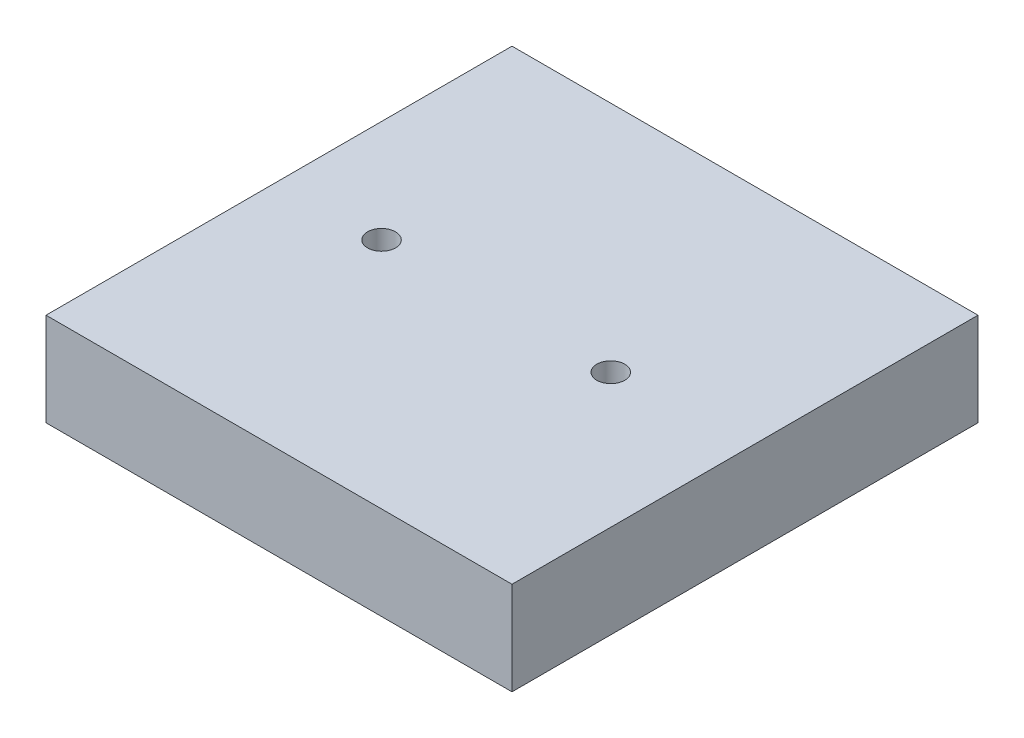
ISO-10303-21;
HEADER;
FILE_DESCRIPTION(('STEP AP214'),'2;1');
FILE_NAME('part.step','',(''),(''),'','','');
FILE_SCHEMA(('AUTOMOTIVE_DESIGN { 1 0 10303 214 1 1 1 1 }'));
ENDSEC;
DATA;
#1=APPLICATION_CONTEXT('core data for automotive mechanical design processes');
#2=APPLICATION_PROTOCOL_DEFINITION('international standard','automotive_design',2000,#1);
#3=PRODUCT_CONTEXT('',#1,'mechanical');
#4=PRODUCT('Part','Part','',(#3));
#5=PRODUCT_RELATED_PRODUCT_CATEGORY('part','',(#4));
#6=PRODUCT_DEFINITION_FORMATION('','',#4);
#7=PRODUCT_DEFINITION_CONTEXT('part definition',#1,'design');
#8=PRODUCT_DEFINITION('design','',#6,#7);
#9=PRODUCT_DEFINITION_SHAPE('','',#8);
#10=(LENGTH_UNIT() NAMED_UNIT(*) SI_UNIT(.MILLI.,.METRE.));
#11=(NAMED_UNIT(*) PLANE_ANGLE_UNIT() SI_UNIT($,.RADIAN.));
#12=(NAMED_UNIT(*) SI_UNIT($,.STERADIAN.) SOLID_ANGLE_UNIT());
#13=UNCERTAINTY_MEASURE_WITH_UNIT(LENGTH_MEASURE(1.E-05),#10,'distance_accuracy_value','');
#14=(GEOMETRIC_REPRESENTATION_CONTEXT(3) GLOBAL_UNCERTAINTY_ASSIGNED_CONTEXT((#13)) GLOBAL_UNIT_ASSIGNED_CONTEXT((#10,
#11,#12)) REPRESENTATION_CONTEXT('',''));
#15=CARTESIAN_POINT('',(0.,0.,0.));
#16=DIRECTION('',(0.,0.,1.));
#17=DIRECTION('',(1.,0.,0.));
#18=AXIS2_PLACEMENT_3D('',#15,#16,#17);
#19=CARTESIAN_POINT('',(0.,10.,25.));
#20=DIRECTION('',(0.,0.,-1.));
#21=DIRECTION('',(-1.,0.,0.));
#22=AXIS2_PLACEMENT_3D('',#19,#20,#21);
#23=PLANE('',#22);
#24=DIRECTION('',(1.,0.,0.));
#25=VECTOR('',#24,1.);
#26=CARTESIAN_POINT('',(0.,0.,25.));
#27=LINE('',#26,#25);
#28=CARTESIAN_POINT('',(-25.,0.,25.));
#29=VERTEX_POINT('',#28);
#30=CARTESIAN_POINT('',(25.,0.,25.));
#31=VERTEX_POINT('',#30);
#32=EDGE_CURVE('E112',#29,#31,#27,.T.);
#33=ORIENTED_EDGE('',*,*,#32,.T.);
#34=DIRECTION('',(0.,-1.,0.));
#35=VECTOR('',#34,1.);
#36=CARTESIAN_POINT('',(25.,10.,25.));
#37=LINE('',#36,#35);
#38=CARTESIAN_POINT('',(25.,10.,25.));
#39=VERTEX_POINT('',#38);
#40=EDGE_CURVE('E11',#39,#31,#37,.T.);
#41=ORIENTED_EDGE('',*,*,#40,.F.);
#42=DIRECTION('',(1.,0.,0.));
#43=VECTOR('',#42,1.);
#44=CARTESIAN_POINT('',(0.,10.,25.));
#45=LINE('',#44,#43);
#46=CARTESIAN_POINT('',(-25.,10.,25.));
#47=VERTEX_POINT('',#46);
#48=EDGE_CURVE('E92',#47,#39,#45,.T.);
#49=ORIENTED_EDGE('',*,*,#48,.F.);
#50=DIRECTION('',(0.,-1.,0.));
#51=VECTOR('',#50,1.);
#52=CARTESIAN_POINT('',(-25.,10.,25.));
#53=LINE('',#52,#51);
#54=EDGE_CURVE('E58',#47,#29,#53,.T.);
#55=ORIENTED_EDGE('',*,*,#54,.T.);
#56=EDGE_LOOP('',(#33,#41,#49,#55));
#57=FACE_BOUND('',#56,.T.);
#58=ADVANCED_FACE('F41',(#57),#23,.F.);
#59=CARTESIAN_POINT('',(25.,10.,0.));
#60=DIRECTION('',(-1.,0.,0.));
#61=DIRECTION('',(0.,0.,1.));
#62=AXIS2_PLACEMENT_3D('',#59,#60,#61);
#63=PLANE('',#62);
#64=DIRECTION('',(0.,0.,-1.));
#65=VECTOR('',#64,1.);
#66=CARTESIAN_POINT('',(25.,0.,0.));
#67=LINE('',#66,#65);
#68=CARTESIAN_POINT('',(25.,0.,-25.));
#69=VERTEX_POINT('',#68);
#70=EDGE_CURVE('E97',#31,#69,#67,.T.);
#71=ORIENTED_EDGE('',*,*,#70,.T.);
#72=DIRECTION('',(0.,-1.,0.));
#73=VECTOR('',#72,1.);
#74=CARTESIAN_POINT('',(25.,10.,-25.));
#75=LINE('',#74,#73);
#76=CARTESIAN_POINT('',(25.,10.,-25.));
#77=VERTEX_POINT('',#76);
#78=EDGE_CURVE('E50',#77,#69,#75,.T.);
#79=ORIENTED_EDGE('',*,*,#78,.F.);
#80=DIRECTION('',(0.,0.,-1.));
#81=VECTOR('',#80,1.);
#82=CARTESIAN_POINT('',(25.,10.,0.));
#83=LINE('',#82,#81);
#84=EDGE_CURVE('E83',#39,#77,#83,.T.);
#85=ORIENTED_EDGE('',*,*,#84,.F.);
#86=ORIENTED_EDGE('',*,*,#40,.T.);
#87=EDGE_LOOP('',(#71,#79,#85,#86));
#88=FACE_BOUND('',#87,.T.);
#89=ADVANCED_FACE('F96',(#88),#63,.F.);
#90=CARTESIAN_POINT('',(0.,10.,-25.));
#91=DIRECTION('',(0.,0.,-1.));
#92=DIRECTION('',(-1.,0.,0.));
#93=AXIS2_PLACEMENT_3D('',#90,#91,#92);
#94=PLANE('',#93);
#95=DIRECTION('',(1.,0.,0.));
#96=VECTOR('',#95,1.);
#97=CARTESIAN_POINT('',(0.,0.,-25.));
#98=LINE('',#97,#96);
#99=CARTESIAN_POINT('',(-25.,0.,-25.));
#100=VERTEX_POINT('',#99);
#101=EDGE_CURVE('E115',#100,#69,#98,.T.);
#102=ORIENTED_EDGE('',*,*,#101,.F.);
#103=DIRECTION('',(0.,-1.,0.));
#104=VECTOR('',#103,1.);
#105=CARTESIAN_POINT('',(-25.,10.,-25.));
#106=LINE('',#105,#104);
#107=CARTESIAN_POINT('',(-25.,10.,-25.));
#108=VERTEX_POINT('',#107);
#109=EDGE_CURVE('E72',#108,#100,#106,.T.);
#110=ORIENTED_EDGE('',*,*,#109,.F.);
#111=DIRECTION('',(1.,0.,0.));
#112=VECTOR('',#111,1.);
#113=CARTESIAN_POINT('',(0.,10.,-25.));
#114=LINE('',#113,#112);
#115=EDGE_CURVE('E91',#108,#77,#114,.T.);
#116=ORIENTED_EDGE('',*,*,#115,.T.);
#117=ORIENTED_EDGE('',*,*,#78,.T.);
#118=EDGE_LOOP('',(#102,#110,#116,#117));
#119=FACE_BOUND('',#118,.T.);
#120=ADVANCED_FACE('F100',(#119),#94,.T.);
#121=CARTESIAN_POINT('',(-25.,10.,0.));
#122=DIRECTION('',(-1.,0.,0.));
#123=DIRECTION('',(0.,0.,1.));
#124=AXIS2_PLACEMENT_3D('',#121,#122,#123);
#125=PLANE('',#124);
#126=DIRECTION('',(0.,0.,-1.));
#127=VECTOR('',#126,1.);
#128=CARTESIAN_POINT('',(-25.,0.,0.));
#129=LINE('',#128,#127);
#130=EDGE_CURVE('E117',#29,#100,#129,.T.);
#131=ORIENTED_EDGE('',*,*,#130,.F.);
#132=ORIENTED_EDGE('',*,*,#54,.F.);
#133=DIRECTION('',(0.,0.,-1.));
#134=VECTOR('',#133,1.);
#135=CARTESIAN_POINT('',(-25.,10.,0.));
#136=LINE('',#135,#134);
#137=EDGE_CURVE('E101',#47,#108,#136,.T.);
#138=ORIENTED_EDGE('',*,*,#137,.T.);
#139=ORIENTED_EDGE('',*,*,#109,.T.);
#140=EDGE_LOOP('',(#131,#132,#138,#139));
#141=FACE_BOUND('',#140,.T.);
#142=ADVANCED_FACE('F153',(#141),#125,.T.);
#143=CARTESIAN_POINT('',(-14.,10.,0.));
#144=DIRECTION('',(0.,-1.,0.));
#145=DIRECTION('',(0.,0.,-1.));
#146=AXIS2_PLACEMENT_3D('',#143,#144,#145);
#147=CYLINDRICAL_SURFACE('',#146,1.5);
#148=CARTESIAN_POINT('',(-14.,10.,0.));
#149=DIRECTION('',(0.,1.,0.));
#150=DIRECTION('',(0.,0.,1.));
#151=AXIS2_PLACEMENT_3D('',#148,#149,#150);
#152=CIRCLE('',#151,1.5);
#153=CARTESIAN_POINT('',(-14.,10.,1.5));
#154=VERTEX_POINT('',#153);
#155=EDGE_CURVE('E123',#154,#154,#152,.T.);
#156=ORIENTED_EDGE('',*,*,#155,.T.);
#157=EDGE_LOOP('',(#156));
#158=FACE_BOUND('',#157,.T.);
#159=CARTESIAN_POINT('',(-14.,0.,0.));
#160=DIRECTION('',(0.,1.,0.));
#161=DIRECTION('',(0.,0.,1.));
#162=AXIS2_PLACEMENT_3D('',#159,#160,#161);
#163=CIRCLE('',#162,1.5);
#164=CARTESIAN_POINT('',(-14.,0.,1.5));
#165=VERTEX_POINT('',#164);
#166=EDGE_CURVE('E109',#165,#165,#163,.T.);
#167=ORIENTED_EDGE('',*,*,#166,.F.);
#168=EDGE_LOOP('',(#167));
#169=FACE_BOUND('',#168,.T.);
#170=ADVANCED_FACE('F43',(#158,#169),#147,.F.);
#171=CARTESIAN_POINT('',(10.6,10.,0.));
#172=DIRECTION('',(0.,-1.,0.));
#173=DIRECTION('',(0.,0.,-1.));
#174=AXIS2_PLACEMENT_3D('',#171,#172,#173);
#175=CYLINDRICAL_SURFACE('',#174,1.5);
#176=CARTESIAN_POINT('',(10.6,10.,0.));
#177=DIRECTION('',(0.,1.,0.));
#178=DIRECTION('',(0.,0.,1.));
#179=AXIS2_PLACEMENT_3D('',#176,#177,#178);
#180=CIRCLE('',#179,1.5);
#181=CARTESIAN_POINT('',(10.6,10.,1.50000000000001));
#182=VERTEX_POINT('',#181);
#183=EDGE_CURVE('E103',#182,#182,#180,.T.);
#184=ORIENTED_EDGE('',*,*,#183,.T.);
#185=EDGE_LOOP('',(#184));
#186=FACE_BOUND('',#185,.T.);
#187=CARTESIAN_POINT('',(10.6,0.,0.));
#188=DIRECTION('',(0.,1.,0.));
#189=DIRECTION('',(0.,0.,1.));
#190=AXIS2_PLACEMENT_3D('',#187,#188,#189);
#191=CIRCLE('',#190,1.5);
#192=CARTESIAN_POINT('',(10.6,0.,1.50000000000001));
#193=VERTEX_POINT('',#192);
#194=EDGE_CURVE('E120',#193,#193,#191,.T.);
#195=ORIENTED_EDGE('',*,*,#194,.F.);
#196=EDGE_LOOP('',(#195));
#197=FACE_BOUND('',#196,.T.);
#198=ADVANCED_FACE('F135',(#186,#197),#175,.F.);
#199=CARTESIAN_POINT('',(0.,10.,0.));
#200=DIRECTION('',(0.,1.,0.));
#201=DIRECTION('',(0.,0.,1.));
#202=AXIS2_PLACEMENT_3D('',#199,#200,#201);
#203=PLANE('',#202);
#204=ORIENTED_EDGE('',*,*,#155,.F.);
#205=EDGE_LOOP('',(#204));
#206=FACE_BOUND('',#205,.T.);
#207=ORIENTED_EDGE('',*,*,#48,.T.);
#208=ORIENTED_EDGE('',*,*,#84,.T.);
#209=ORIENTED_EDGE('',*,*,#115,.F.);
#210=ORIENTED_EDGE('',*,*,#137,.F.);
#211=EDGE_LOOP('',(#207,#208,#209,#210));
#212=FACE_BOUND('',#211,.T.);
#213=ORIENTED_EDGE('',*,*,#183,.F.);
#214=EDGE_LOOP('',(#213));
#215=FACE_BOUND('',#214,.T.);
#216=ADVANCED_FACE('F87',(#206,#212,#215),#203,.T.);
#217=CARTESIAN_POINT('',(0.,0.,0.));
#218=DIRECTION('',(0.,1.,0.));
#219=DIRECTION('',(0.,0.,1.));
#220=AXIS2_PLACEMENT_3D('',#217,#218,#219);
#221=PLANE('',#220);
#222=ORIENTED_EDGE('',*,*,#166,.T.);
#223=EDGE_LOOP('',(#222));
#224=FACE_BOUND('',#223,.T.);
#225=ORIENTED_EDGE('',*,*,#32,.F.);
#226=ORIENTED_EDGE('',*,*,#130,.T.);
#227=ORIENTED_EDGE('',*,*,#101,.T.);
#228=ORIENTED_EDGE('',*,*,#70,.F.);
#229=EDGE_LOOP('',(#225,#226,#227,#228));
#230=FACE_BOUND('',#229,.T.);
#231=ORIENTED_EDGE('',*,*,#194,.T.);
#232=EDGE_LOOP('',(#231));
#233=FACE_BOUND('',#232,.T.);
#234=ADVANCED_FACE('F134',(#224,#230,#233),#221,.F.);
#235=CLOSED_SHELL('',(#58,#89,#120,#142,#170,#198,#216,#234));
#236=MANIFOLD_SOLID_BREP('B2',#235);
#237=ADVANCED_BREP_SHAPE_REPRESENTATION('',(#18,#236),#14);
#238=SHAPE_DEFINITION_REPRESENTATION(#9,#237);
ENDSEC;
END-ISO-10303-21;
